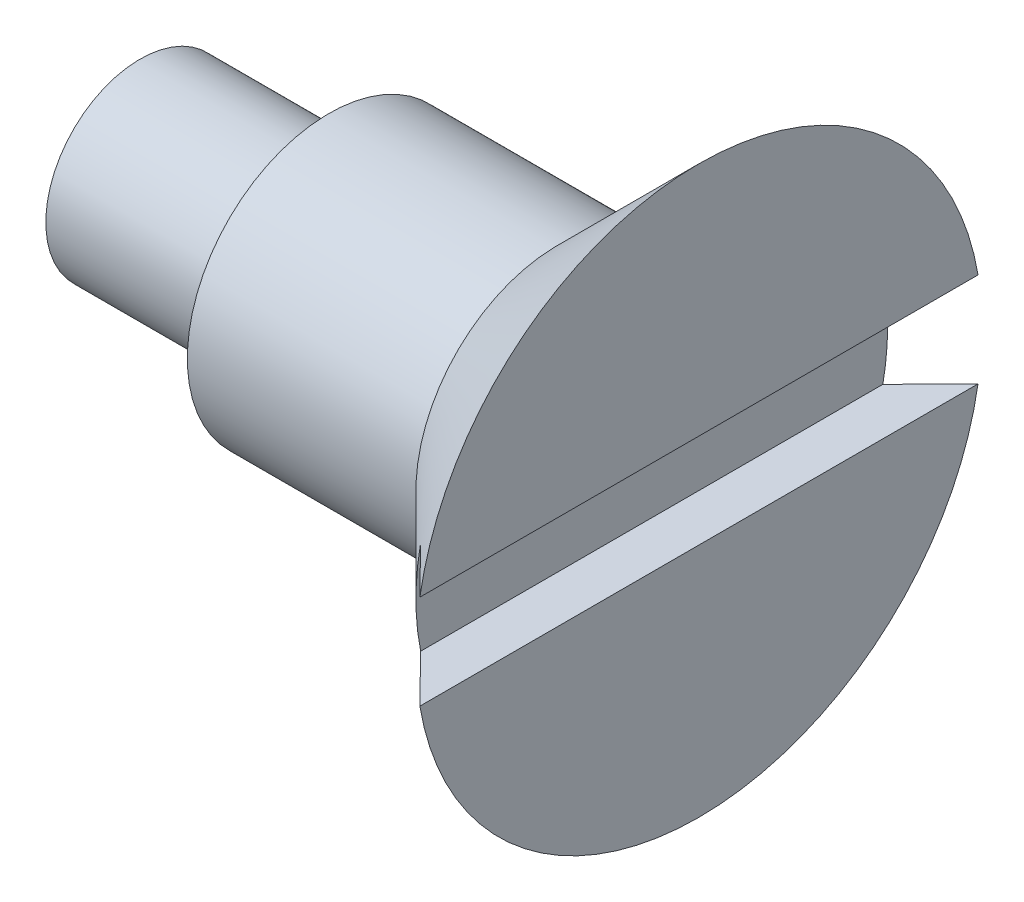
ISO-10303-21;
HEADER;
FILE_DESCRIPTION(('STEP AP214'),'2;1');
FILE_NAME('part.step','',(''),(''),'','','');
FILE_SCHEMA(('AUTOMOTIVE_DESIGN { 1 0 10303 214 1 1 1 1 }'));
ENDSEC;
DATA;
#1=APPLICATION_CONTEXT('core data for automotive mechanical design processes');
#2=APPLICATION_PROTOCOL_DEFINITION('international standard','automotive_design',2000,#1);
#3=PRODUCT_CONTEXT('',#1,'mechanical');
#4=PRODUCT('Part','Part','',(#3));
#5=PRODUCT_RELATED_PRODUCT_CATEGORY('part','',(#4));
#6=PRODUCT_DEFINITION_FORMATION('','',#4);
#7=PRODUCT_DEFINITION_CONTEXT('part definition',#1,'design');
#8=PRODUCT_DEFINITION('design','',#6,#7);
#9=PRODUCT_DEFINITION_SHAPE('','',#8);
#10=(LENGTH_UNIT() NAMED_UNIT(*) SI_UNIT(.MILLI.,.METRE.));
#11=(NAMED_UNIT(*) PLANE_ANGLE_UNIT() SI_UNIT($,.RADIAN.));
#12=(NAMED_UNIT(*) SI_UNIT($,.STERADIAN.) SOLID_ANGLE_UNIT());
#13=UNCERTAINTY_MEASURE_WITH_UNIT(LENGTH_MEASURE(1.E-05),#10,'distance_accuracy_value','');
#14=(GEOMETRIC_REPRESENTATION_CONTEXT(3) GLOBAL_UNCERTAINTY_ASSIGNED_CONTEXT((#13)) GLOBAL_UNIT_ASSIGNED_CONTEXT((#10,
#11,#12)) REPRESENTATION_CONTEXT('',''));
#15=CARTESIAN_POINT('',(0.,0.,0.));
#16=DIRECTION('',(0.,0.,1.));
#17=DIRECTION('',(1.,0.,0.));
#18=AXIS2_PLACEMENT_3D('',#15,#16,#17);
#19=CARTESIAN_POINT('',(0.,0.,5.99999999999997));
#20=DIRECTION('',(-1.,0.,0.));
#21=DIRECTION('',(0.,0.,1.));
#22=AXIS2_PLACEMENT_3D('',#19,#20,#21);
#23=PLANE('',#22);
#24=CARTESIAN_POINT('',(0.,0.,0.));
#25=DIRECTION('',(1.,0.,0.));
#26=DIRECTION('',(0.,0.,-1.));
#27=AXIS2_PLACEMENT_3D('',#24,#25,#26);
#28=CIRCLE('',#27,5.99999999999997);
#29=CARTESIAN_POINT('',(0.,-1.,5.91607978309958));
#30=VERTEX_POINT('',#29);
#31=CARTESIAN_POINT('',(0.,-1.,-5.91607978309958));
#32=VERTEX_POINT('',#31);
#33=EDGE_CURVE('E97',#30,#32,#28,.T.);
#34=ORIENTED_EDGE('',*,*,#33,.T.);
#35=DIRECTION('',(0.,0.,1.));
#36=VECTOR('',#35,1.);
#37=CARTESIAN_POINT('',(0.,-1.,5.99999999999997));
#38=LINE('',#37,#36);
#39=EDGE_CURVE('E83',#32,#30,#38,.T.);
#40=ORIENTED_EDGE('',*,*,#39,.T.);
#41=EDGE_LOOP('',(#34,#40));
#42=FACE_BOUND('',#41,.T.);
#43=ADVANCED_FACE('F37',(#42),#23,.F.);
#44=CARTESIAN_POINT('',(-13.,0.,0.));
#45=DIRECTION('',(1.,0.,0.));
#46=DIRECTION('',(0.,0.,-1.));
#47=AXIS2_PLACEMENT_3D('',#44,#45,#46);
#48=CONICAL_SURFACE('',#47,0.,1.0471975511966);
#49=CARTESIAN_POINT('',(-11.8452994616208,0.,0.));
#50=DIRECTION('',(1.,0.,0.));
#51=DIRECTION('',(0.,0.,-1.));
#52=AXIS2_PLACEMENT_3D('',#49,#50,#51);
#53=CIRCLE('',#52,2.);
#54=CARTESIAN_POINT('',(-11.8452994616208,0.,-2.));
#55=VERTEX_POINT('',#54);
#56=EDGE_CURVE('E84',#55,#55,#53,.T.);
#57=ORIENTED_EDGE('',*,*,#56,.F.);
#58=EDGE_LOOP('',(#57));
#59=FACE_BOUND('',#58,.T.);
#60=CARTESIAN_POINT('',(-13.,0.,0.));
#61=VERTEX_POINT('',#60);
#62=VERTEX_LOOP('',#61);
#63=FACE_BOUND('',#62,.T.);
#64=ADVANCED_FACE('F39',(#59,#63),#48,.T.);
#65=CARTESIAN_POINT('',(0.,0.,0.));
#66=DIRECTION('',(1.,0.,0.));
#67=DIRECTION('',(0.,0.,-1.));
#68=AXIS2_PLACEMENT_3D('',#65,#66,#67);
#69=CYLINDRICAL_SURFACE('',#68,2.);
#70=CARTESIAN_POINT('',(-7.84529946162076,0.,0.));
#71=DIRECTION('',(1.,0.,0.));
#72=DIRECTION('',(0.,0.,-1.));
#73=AXIS2_PLACEMENT_3D('',#70,#71,#72);
#74=CIRCLE('',#73,2.);
#75=CARTESIAN_POINT('',(-7.84529946162076,0.,-2.));
#76=VERTEX_POINT('',#75);
#77=EDGE_CURVE('E115',#76,#76,#74,.T.);
#78=ORIENTED_EDGE('',*,*,#77,.F.);
#79=EDGE_LOOP('',(#78));
#80=FACE_BOUND('',#79,.T.);
#81=ORIENTED_EDGE('',*,*,#56,.T.);
#82=EDGE_LOOP('',(#81));
#83=FACE_BOUND('',#82,.T.);
#84=ADVANCED_FACE('F153',(#80,#83),#69,.T.);
#85=CARTESIAN_POINT('',(-7.84529946162076,0.,3.));
#86=DIRECTION('',(1.,0.,0.));
#87=DIRECTION('',(0.,0.,-1.));
#88=AXIS2_PLACEMENT_3D('',#85,#86,#87);
#89=PLANE('',#88);
#90=CARTESIAN_POINT('',(-7.84529946162076,0.,0.));
#91=DIRECTION('',(1.,0.,0.));
#92=DIRECTION('',(0.,0.,-1.));
#93=AXIS2_PLACEMENT_3D('',#90,#91,#92);
#94=CIRCLE('',#93,3.);
#95=CARTESIAN_POINT('',(-7.84529946162076,0.,-3.));
#96=VERTEX_POINT('',#95);
#97=EDGE_CURVE('E100',#96,#96,#94,.T.);
#98=ORIENTED_EDGE('',*,*,#97,.F.);
#99=EDGE_LOOP('',(#98));
#100=FACE_BOUND('',#99,.T.);
#101=ORIENTED_EDGE('',*,*,#77,.T.);
#102=EDGE_LOOP('',(#101));
#103=FACE_BOUND('',#102,.T.);
#104=ADVANCED_FACE('F206',(#100,#103),#89,.F.);
#105=CARTESIAN_POINT('',(0.,0.,0.));
#106=DIRECTION('',(1.,0.,0.));
#107=DIRECTION('',(0.,0.,-1.));
#108=AXIS2_PLACEMENT_3D('',#105,#106,#107);
#109=CYLINDRICAL_SURFACE('',#108,3.);
#110=CARTESIAN_POINT('',(-3.,0.,0.));
#111=DIRECTION('',(1.,0.,0.));
#112=DIRECTION('',(0.,0.,-1.));
#113=AXIS2_PLACEMENT_3D('',#110,#111,#112);
#114=CIRCLE('',#113,3.);
#115=CARTESIAN_POINT('',(-3.,0.,-3.));
#116=VERTEX_POINT('',#115);
#117=EDGE_CURVE('E96',#116,#116,#114,.T.);
#118=ORIENTED_EDGE('',*,*,#117,.F.);
#119=EDGE_LOOP('',(#118));
#120=FACE_BOUND('',#119,.T.);
#121=ORIENTED_EDGE('',*,*,#97,.T.);
#122=EDGE_LOOP('',(#121));
#123=FACE_BOUND('',#122,.T.);
#124=ADVANCED_FACE('F148',(#120,#123),#109,.T.);
#125=CARTESIAN_POINT('',(-3.,0.,0.));
#126=DIRECTION('',(1.,0.,0.));
#127=DIRECTION('',(0.,0.,-1.));
#128=AXIS2_PLACEMENT_3D('',#125,#126,#127);
#129=CONICAL_SURFACE('',#128,3.,0.785398163397443);
#130=ORIENTED_EDGE('',*,*,#33,.F.);
#131=CARTESIAN_POINT('',(0.0007,-1.,5.91678971149048));
#132=CARTESIAN_POINT('',(-0.162607318509315,-1.,5.75115761852884));
#133=CARTESIAN_POINT('',(-0.325826519206074,-1.,5.58543840697202));
#134=CARTESIAN_POINT('',(-0.65215059662722,-1.,5.25361083834429));
#135=CARTESIAN_POINT('',(-0.81525525889978,-1.,5.08750227041045));
#136=CARTESIAN_POINT('',(-1.14363850904817,-1.,4.75240700108424));
#137=CARTESIAN_POINT('',(-1.30891199112516,-1.,4.58341529410106));
#138=CARTESIAN_POINT('',(-1.63885108719332,-1.,4.24511761475711));
#139=CARTESIAN_POINT('',(-1.80351709676078,-1.,4.07581202850019));
#140=CARTESIAN_POINT('',(-2.09113646904427,-1.,3.77891608066379));
#141=CARTESIAN_POINT('',(-2.21423646328889,-1.,3.65146784044968));
#142=CARTESIAN_POINT('',(-2.45993602788147,-1.,3.3960670966622));
#143=CARTESIAN_POINT('',(-2.58253555139033,-1.,3.26811454799765));
#144=CARTESIAN_POINT('',(-2.82739638158381,-1.,3.01113677517779));
#145=CARTESIAN_POINT('',(-2.94965550415176,-1.,2.88210946641282));
#146=CARTESIAN_POINT('',(-3.19308474715153,-1.,2.62311457687469));
#147=CARTESIAN_POINT('',(-3.31425522947932,-1.,2.49314733661333));
#148=CARTESIAN_POINT('',(-3.55347734543775,-1.,2.23339140104992));
#149=CARTESIAN_POINT('',(-3.67154904331894,-1.,2.10362129445326));
#150=CARTESIAN_POINT('',(-3.84678919114967,-1.,1.90713907998698));
#151=CARTESIAN_POINT('',(-3.90493003546028,-1.,1.84129534116474));
#152=CARTESIAN_POINT('',(-4.02033272590618,-1.,1.70884318625084));
#153=CARTESIAN_POINT('',(-4.07759459789594,-1.,1.64223479275218));
#154=CARTESIAN_POINT('',(-4.19059705198423,-1.,1.50838317640004));
#155=CARTESIAN_POINT('',(-4.24634442439442,-1.,1.44114570319739));
#156=CARTESIAN_POINT('',(-4.35615224777919,-1.,1.30531180859632));
#157=CARTESIAN_POINT('',(-4.41021292855056,-1.,1.23671557441733));
#158=CARTESIAN_POINT('',(-4.51573124180686,-1.,1.09776921510259));
#159=CARTESIAN_POINT('',(-4.56719412184081,-1.,1.02742309246133));
#160=CARTESIAN_POINT('',(-4.66625244668362,-1.,0.884073142096053));
#161=CARTESIAN_POINT('',(-4.71385121903676,-1.,0.811071681165573));
#162=CARTESIAN_POINT('',(-4.76841426729248,-1.,0.719019988854483));
#163=CARTESIAN_POINT('',(-4.77841389742968,-1.,0.70176695507006));
#164=CARTESIAN_POINT('',(-4.79802849740676,-1.,0.667039630778522));
#165=CARTESIAN_POINT('',(-4.80764339579793,-1.,0.649565299960209));
#166=CARTESIAN_POINT('',(-4.83583751773938,-1.,0.596790988044159));
#167=CARTESIAN_POINT('',(-4.85376700288692,-1.,0.561138294982837));
#168=CARTESIAN_POINT('',(-4.88724060678036,-1.,0.489122011077072));
#169=CARTESIAN_POINT('',(-4.90280525875267,-1.,0.45276804835838));
#170=CARTESIAN_POINT('',(-4.93114067114615,-1.,0.378971239176999));
#171=CARTESIAN_POINT('',(-4.94391179513829,-1.,0.341528535130862));
#172=CARTESIAN_POINT('',(-4.96331492806248,-1.,0.274731331464051));
#173=CARTESIAN_POINT('',(-4.9706847076367,-1.,0.245592117583684));
#174=CARTESIAN_POINT('',(-4.98310321325922,-1.,0.186824201623296));
#175=CARTESIAN_POINT('',(-4.98815258527316,-1.,0.157195638152875));
#176=CARTESIAN_POINT('',(-4.99567262062052,-1.,0.0976784753360516));
#177=CARTESIAN_POINT('',(-4.99814938437632,-1.,0.0677906613999327));
#178=CARTESIAN_POINT('',(-5.00041846078121,-1.,0.00791054321230838));
#179=CARTESIAN_POINT('',(-5.00021013857005,-1.,-0.022081784074385));
#180=CARTESIAN_POINT('',(-4.99552925768517,-1.,-0.111783048402298));
#181=CARTESIAN_POINT('',(-4.98701338219495,-1.,-0.171315029823867));
#182=CARTESIAN_POINT('',(-4.96083485299349,-1.,-0.288388298411591));
#183=CARTESIAN_POINT('',(-4.94314197860661,-1.,-0.345922334134468));
#184=CARTESIAN_POINT('',(-4.89569716333322,-1.,-0.473105905003865));
#185=CARTESIAN_POINT('',(-4.86400465704331,-1.,-0.542008375387887));
#186=CARTESIAN_POINT('',(-4.79406188189462,-1.,-0.676454737242399));
#187=CARTESIAN_POINT('',(-4.75579650178786,-1.,-0.741990427025854));
#188=CARTESIAN_POINT('',(-4.67483861075862,-1.,-0.870968335153202));
#189=CARTESIAN_POINT('',(-4.63211286143669,-1.,-0.93438938829629));
#190=CARTESIAN_POINT('',(-4.56600477030899,-1.,-1.02801925947388));
#191=CARTESIAN_POINT('',(-4.54364457678581,-1.,-1.05896289027808));
#192=CARTESIAN_POINT('',(-4.49835630127878,-1.,-1.12043124705164));
#193=CARTESIAN_POINT('',(-4.47542823551307,-1.,-1.15095598494575));
#194=CARTESIAN_POINT('',(-4.4004777659838,-1.,-1.24916076388308));
#195=CARTESIAN_POINT('',(-4.3475240183481,-1.,-1.31612926321496));
#196=CARTESIAN_POINT('',(-4.24003359841043,-1.,-1.44878719461384));
#197=CARTESIAN_POINT('',(-4.18549671889329,-1.,-1.51447645734511));
#198=CARTESIAN_POINT('',(-4.07527537432535,-1.,-1.64492622970131));
#199=CARTESIAN_POINT('',(-4.01959047448894,-1.,-1.70968637109029));
#200=CARTESIAN_POINT('',(-3.90738823153224,-1.,-1.83848251738067));
#201=CARTESIAN_POINT('',(-3.85087086495262,-1.,-1.90251850178474));
#202=CARTESIAN_POINT('',(-3.6802179026296,-1.,-2.09398481773312));
#203=CARTESIAN_POINT('',(-3.56514686943538,-1.,-2.22058045835915));
#204=CARTESIAN_POINT('',(-3.33352351173097,-1.,-2.4723465492548));
#205=CARTESIAN_POINT('',(-3.21697153933208,-1.,-2.5975173253648));
#206=CARTESIAN_POINT('',(-2.98338065364163,-1.,-2.846370506011));
#207=CARTESIAN_POINT('',(-2.86634612800305,-1.,-2.97005703316858));
#208=CARTESIAN_POINT('',(-2.63158070939988,-1.,-3.21678023725537));
#209=CARTESIAN_POINT('',(-2.5138497757386,-1.,-3.33981687539496));
#210=CARTESIAN_POINT('',(-2.16009615265814,-1.,-3.70803979106433));
#211=CARTESIAN_POINT('',(-1.92334028700561,-1.,-3.95252136145085));
#212=CARTESIAN_POINT('',(-1.54616199235268,-1.,-4.34024616466515));
#213=CARTESIAN_POINT('',(-1.40609960761181,-1.,-4.48384082068329));
#214=CARTESIAN_POINT('',(-1.1256502353192,-1.,-4.77076673689435));
#215=CARTESIAN_POINT('',(-0.985263190763728,-1.,-4.91409794140606));
#216=CARTESIAN_POINT('',(-0.70403532911954,-1.,-5.20077057030037));
#217=CARTESIAN_POINT('',(-0.563194145351994,-1.,-5.34411163473207));
#218=CARTESIAN_POINT('',(-0.281357934914174,-1.,-5.63058737243485));
#219=CARTESIAN_POINT('',(-0.140362943663766,-1.,-5.77372208054851));
#220=CARTESIAN_POINT('',(0.000699999999999637,-1.,-5.91678971149048));
#221=B_SPLINE_CURVE_WITH_KNOTS('',3,(#131,#132,#133,#134,#135,#136,#137,#138,#139,#140,#141,
#142,#143,#144,#145,#146,#147,#148,#149,#150,#151,#152,#153,#154,#155,#156,#157,#158,#159,#160,
#161,#162,#163,#164,#165,#166,#167,#168,#169,#170,#171,#172,#173,#174,#175,#176,#177,#178,#179,
#180,#181,#182,#183,#184,#185,#186,#187,#188,#189,#190,#191,#192,#193,#194,#195,#196,#197,#198,
#199,#200,#201,#202,#203,#204,#205,#206,#207,#208,#209,#210,#211,#212,#213,#214,#215,#216,#217,
#218,#219,#220),.UNSPECIFIED.,.F.,.F.,(4,2,2,2,2,2,2,2,2,2,2,2,2,2,2,2,2,2,2,2,2,2,2,2,2,2,2,2,
2,2,2,2,2,2,2,2,2,2,2,2,2,2,2,2,4),(0.,0.697803517038659,1.39619900961924,2.10532581424133,
2.81385354230447,3.34542560714681,3.87704633085894,4.41029440011359,4.94335810483505,
5.46967005392525,5.73318276579127,5.99668771167144,6.25869692042871,6.52067027547976,
6.7820913299544,7.04328482162607,7.10310466318572,7.16293556283866,7.28259249608506,
7.40114244661833,7.51967695896752,7.60976612612796,7.69983019863976,7.78968021136254,
7.87955146856271,8.05899978683347,8.23904283195005,8.46597578037929,8.69343761415733,
8.92273527289017,9.03726247596328,9.1517864119628,9.4078708319171,9.66398892309654,
9.92020586273888,10.1764300365691,10.6896409306576,11.2027320047635,11.7135693246928,
12.2244367977944,13.2454191574668,13.8471932047474,14.4490824444518,15.0519472067194,
15.6546942226632),.UNSPECIFIED.);
#222=CARTESIAN_POINT('',(-1.,-1.,4.89897948556633));
#223=VERTEX_POINT('',#222);
#224=EDGE_CURVE('E103',#30,#223,#221,.T.);
#225=ORIENTED_EDGE('',*,*,#224,.T.);
#226=CARTESIAN_POINT('',(-1.,0.,0.));
#227=DIRECTION('',(1.,0.,0.));
#228=DIRECTION('',(0.,0.,-1.));
#229=AXIS2_PLACEMENT_3D('',#226,#227,#228);
#230=CIRCLE('',#229,4.99999999999998);
#231=CARTESIAN_POINT('',(-1.,1.,4.89897948556633));
#232=VERTEX_POINT('',#231);
#233=EDGE_CURVE('E11',#232,#223,#230,.T.);
#234=ORIENTED_EDGE('',*,*,#233,.F.);
#235=CARTESIAN_POINT('',(0.0007,1.,-5.91678971149048));
#236=CARTESIAN_POINT('',(-0.162607318509315,1.,-5.75115761852884));
#237=CARTESIAN_POINT('',(-0.325826519206074,1.,-5.58543840697202));
#238=CARTESIAN_POINT('',(-0.65215059662722,1.,-5.25361083834429));
#239=CARTESIAN_POINT('',(-0.81525525889978,1.,-5.08750227041045));
#240=CARTESIAN_POINT('',(-1.14363850904817,1.,-4.75240700108424));
#241=CARTESIAN_POINT('',(-1.30891199112516,1.,-4.58341529410106));
#242=CARTESIAN_POINT('',(-1.63885108719332,1.,-4.24511761475711));
#243=CARTESIAN_POINT('',(-1.80351709676078,1.,-4.07581202850019));
#244=CARTESIAN_POINT('',(-2.09113646904427,1.,-3.77891608066379));
#245=CARTESIAN_POINT('',(-2.21423646328889,1.,-3.65146784044968));
#246=CARTESIAN_POINT('',(-2.45993602788147,1.,-3.3960670966622));
#247=CARTESIAN_POINT('',(-2.58253555139033,1.,-3.26811454799765));
#248=CARTESIAN_POINT('',(-2.82739638158381,1.,-3.01113677517779));
#249=CARTESIAN_POINT('',(-2.94965550415176,1.,-2.88210946641282));
#250=CARTESIAN_POINT('',(-3.19308474715153,1.,-2.62311457687469));
#251=CARTESIAN_POINT('',(-3.31425522947932,1.,-2.49314733661333));
#252=CARTESIAN_POINT('',(-3.55347734543775,1.,-2.23339140104992));
#253=CARTESIAN_POINT('',(-3.67154904331894,1.,-2.10362129445326));
#254=CARTESIAN_POINT('',(-3.84678919114967,1.,-1.90713907998698));
#255=CARTESIAN_POINT('',(-3.90493003546028,1.,-1.84129534116474));
#256=CARTESIAN_POINT('',(-4.02033272590618,1.,-1.70884318625084));
#257=CARTESIAN_POINT('',(-4.07759459789594,1.,-1.64223479275218));
#258=CARTESIAN_POINT('',(-4.19059705198423,1.,-1.50838317640004));
#259=CARTESIAN_POINT('',(-4.24634442439442,1.,-1.44114570319739));
#260=CARTESIAN_POINT('',(-4.35615224777919,1.,-1.30531180859632));
#261=CARTESIAN_POINT('',(-4.41021292855056,1.,-1.23671557441733));
#262=CARTESIAN_POINT('',(-4.51573124180686,1.,-1.09776921510259));
#263=CARTESIAN_POINT('',(-4.56719412184081,1.,-1.02742309246133));
#264=CARTESIAN_POINT('',(-4.66625244668362,1.,-0.884073142096053));
#265=CARTESIAN_POINT('',(-4.71385121903676,1.,-0.811071681165573));
#266=CARTESIAN_POINT('',(-4.76841426729248,1.,-0.719019988854483));
#267=CARTESIAN_POINT('',(-4.77841389742968,1.,-0.70176695507006));
#268=CARTESIAN_POINT('',(-4.79802849740676,1.,-0.667039630778522));
#269=CARTESIAN_POINT('',(-4.80764339579793,1.,-0.649565299960209));
#270=CARTESIAN_POINT('',(-4.83583751773938,1.,-0.596790988044159));
#271=CARTESIAN_POINT('',(-4.85376700288692,1.,-0.561138294982837));
#272=CARTESIAN_POINT('',(-4.88724060678036,1.,-0.489122011077072));
#273=CARTESIAN_POINT('',(-4.90280525875267,1.,-0.45276804835838));
#274=CARTESIAN_POINT('',(-4.93114067114615,1.,-0.378971239176999));
#275=CARTESIAN_POINT('',(-4.94391179513829,1.,-0.341528535130862));
#276=CARTESIAN_POINT('',(-4.96331492806248,1.,-0.274731331464051));
#277=CARTESIAN_POINT('',(-4.9706847076367,1.,-0.245592117583684));
#278=CARTESIAN_POINT('',(-4.98310321325922,1.,-0.186824201623296));
#279=CARTESIAN_POINT('',(-4.98815258527316,1.,-0.157195638152875));
#280=CARTESIAN_POINT('',(-4.99567262062052,1.,-0.0976784753360516));
#281=CARTESIAN_POINT('',(-4.99814938437632,1.,-0.0677906613999327));
#282=CARTESIAN_POINT('',(-5.00041846078121,1.,-0.00791054321230838));
#283=CARTESIAN_POINT('',(-5.00021013857005,1.,0.022081784074385));
#284=CARTESIAN_POINT('',(-4.99552925768517,1.,0.111783048402298));
#285=CARTESIAN_POINT('',(-4.98701338219495,1.,0.171315029823867));
#286=CARTESIAN_POINT('',(-4.96083485299349,1.,0.288388298411591));
#287=CARTESIAN_POINT('',(-4.94314197860661,1.,0.345922334134468));
#288=CARTESIAN_POINT('',(-4.89569716333322,1.,0.473105905003865));
#289=CARTESIAN_POINT('',(-4.86400465704331,1.,0.542008375387887));
#290=CARTESIAN_POINT('',(-4.79406188189462,1.,0.676454737242399));
#291=CARTESIAN_POINT('',(-4.75579650178786,1.,0.741990427025854));
#292=CARTESIAN_POINT('',(-4.67483861075862,1.,0.870968335153202));
#293=CARTESIAN_POINT('',(-4.63211286143669,1.,0.93438938829629));
#294=CARTESIAN_POINT('',(-4.56600477030899,1.,1.02801925947388));
#295=CARTESIAN_POINT('',(-4.54364457678581,1.,1.05896289027808));
#296=CARTESIAN_POINT('',(-4.49835630127878,1.,1.12043124705164));
#297=CARTESIAN_POINT('',(-4.47542823551307,1.,1.15095598494575));
#298=CARTESIAN_POINT('',(-4.4004777659838,1.,1.24916076388308));
#299=CARTESIAN_POINT('',(-4.3475240183481,1.,1.31612926321496));
#300=CARTESIAN_POINT('',(-4.24003359841043,1.,1.44878719461384));
#301=CARTESIAN_POINT('',(-4.18549671889329,1.,1.51447645734511));
#302=CARTESIAN_POINT('',(-4.07527537432535,1.,1.64492622970131));
#303=CARTESIAN_POINT('',(-4.01959047448894,1.,1.70968637109029));
#304=CARTESIAN_POINT('',(-3.90738823153224,1.,1.83848251738067));
#305=CARTESIAN_POINT('',(-3.85087086495262,1.,1.90251850178474));
#306=CARTESIAN_POINT('',(-3.6802179026296,1.,2.09398481773312));
#307=CARTESIAN_POINT('',(-3.56514686943538,1.,2.22058045835915));
#308=CARTESIAN_POINT('',(-3.33352351173097,1.,2.4723465492548));
#309=CARTESIAN_POINT('',(-3.21697153933208,1.,2.5975173253648));
#310=CARTESIAN_POINT('',(-2.98338065364163,1.,2.846370506011));
#311=CARTESIAN_POINT('',(-2.86634612800305,1.,2.97005703316858));
#312=CARTESIAN_POINT('',(-2.63158070939988,1.,3.21678023725537));
#313=CARTESIAN_POINT('',(-2.5138497757386,1.,3.33981687539496));
#314=CARTESIAN_POINT('',(-2.16009615265814,1.,3.70803979106433));
#315=CARTESIAN_POINT('',(-1.92334028700561,1.,3.95252136145085));
#316=CARTESIAN_POINT('',(-1.54616199235268,1.,4.34024616466515));
#317=CARTESIAN_POINT('',(-1.40609960761181,1.,4.48384082068329));
#318=CARTESIAN_POINT('',(-1.1256502353192,1.,4.77076673689435));
#319=CARTESIAN_POINT('',(-0.985263190763728,1.,4.91409794140606));
#320=CARTESIAN_POINT('',(-0.70403532911954,1.,5.20077057030037));
#321=CARTESIAN_POINT('',(-0.563194145351994,1.,5.34411163473207));
#322=CARTESIAN_POINT('',(-0.281357934914174,1.,5.63058737243485));
#323=CARTESIAN_POINT('',(-0.140362943663766,1.,5.77372208054851));
#324=CARTESIAN_POINT('',(0.000699999999999637,1.,5.91678971149048));
#325=B_SPLINE_CURVE_WITH_KNOTS('',3,(#235,#236,#237,#238,#239,#240,#241,#242,#243,#244,#245,
#246,#247,#248,#249,#250,#251,#252,#253,#254,#255,#256,#257,#258,#259,#260,#261,#262,#263,#264,
#265,#266,#267,#268,#269,#270,#271,#272,#273,#274,#275,#276,#277,#278,#279,#280,#281,#282,#283,
#284,#285,#286,#287,#288,#289,#290,#291,#292,#293,#294,#295,#296,#297,#298,#299,#300,#301,#302,
#303,#304,#305,#306,#307,#308,#309,#310,#311,#312,#313,#314,#315,#316,#317,#318,#319,#320,#321,
#322,#323,#324),.UNSPECIFIED.,.F.,.F.,(4,2,2,2,2,2,2,2,2,2,2,2,2,2,2,2,2,2,2,2,2,2,2,2,2,2,2,2,
2,2,2,2,2,2,2,2,2,2,2,2,2,2,2,2,4),(0.,0.697803517038659,1.39619900961924,2.10532581424133,
2.81385354230447,3.34542560714681,3.87704633085894,4.41029440011359,4.94335810483505,
5.46967005392525,5.73318276579127,5.99668771167144,6.25869692042871,6.52067027547976,
6.7820913299544,7.04328482162607,7.10310466318572,7.16293556283866,7.28259249608506,
7.40114244661833,7.51967695896752,7.60976612612796,7.69983019863976,7.78968021136254,
7.87955146856271,8.05899978683347,8.23904283195005,8.46597578037929,8.69343761415733,
8.92273527289017,9.03726247596328,9.1517864119628,9.4078708319171,9.66398892309654,
9.92020586273888,10.1764300365691,10.6896409306576,11.2027320047635,11.7135693246928,
12.2244367977944,13.2454191574668,13.8471932047474,14.4490824444518,15.0519472067194,
15.6546942226632),.UNSPECIFIED.);
#326=CARTESIAN_POINT('',(0.,1.,5.91607978309958));
#327=VERTEX_POINT('',#326);
#328=EDGE_CURVE('E78',#232,#327,#325,.T.);
#329=ORIENTED_EDGE('',*,*,#328,.T.);
#330=CARTESIAN_POINT('',(0.,1.,-5.91607978309958));
#331=VERTEX_POINT('',#330);
#332=EDGE_CURVE('E91',#331,#327,#28,.T.);
#333=ORIENTED_EDGE('',*,*,#332,.F.);
#334=CARTESIAN_POINT('',(-1.,1.,-4.89897948556633));
#335=VERTEX_POINT('',#334);
#336=EDGE_CURVE('E52',#331,#335,#325,.T.);
#337=ORIENTED_EDGE('',*,*,#336,.T.);
#338=CARTESIAN_POINT('',(-1.,-1.,-4.89897948556633));
#339=VERTEX_POINT('',#338);
#340=EDGE_CURVE('E41',#339,#335,#230,.T.);
#341=ORIENTED_EDGE('',*,*,#340,.F.);
#342=EDGE_CURVE('E105',#339,#32,#221,.T.);
#343=ORIENTED_EDGE('',*,*,#342,.T.);
#344=EDGE_LOOP('',(#130,#225,#234,#329,#333,#337,#341,#343));
#345=FACE_BOUND('',#344,.T.);
#346=ORIENTED_EDGE('',*,*,#117,.T.);
#347=EDGE_LOOP('',(#346));
#348=FACE_BOUND('',#347,.T.);
#349=ADVANCED_FACE('F89',(#345,#348),#129,.T.);
#350=ORIENTED_EDGE('',*,*,#332,.T.);
#351=DIRECTION('',(0.,0.,-1.));
#352=VECTOR('',#351,1.);
#353=CARTESIAN_POINT('',(0.,1.,5.99999999999997));
#354=LINE('',#353,#352);
#355=EDGE_CURVE('E75',#327,#331,#354,.T.);
#356=ORIENTED_EDGE('',*,*,#355,.T.);
#357=EDGE_LOOP('',(#350,#356));
#358=FACE_BOUND('',#357,.T.);
#359=ADVANCED_FACE('F95',(#358),#23,.F.);
#360=CARTESIAN_POINT('',(-1.,0.,0.));
#361=DIRECTION('',(1.,0.,0.));
#362=DIRECTION('',(0.,0.,-1.));
#363=AXIS2_PLACEMENT_3D('',#360,#361,#362);
#364=PLANE('',#363);
#365=ORIENTED_EDGE('',*,*,#233,.T.);
#366=DIRECTION('',(0.,0.,-1.));
#367=VECTOR('',#366,1.);
#368=CARTESIAN_POINT('',(-1.,-1.,8.1189559473886));
#369=LINE('',#368,#367);
#370=EDGE_CURVE('E93',#223,#339,#369,.T.);
#371=ORIENTED_EDGE('',*,*,#370,.T.);
#372=ORIENTED_EDGE('',*,*,#340,.T.);
#373=DIRECTION('',(0.,0.,1.));
#374=VECTOR('',#373,1.);
#375=CARTESIAN_POINT('',(-1.,1.,8.1189559473886));
#376=LINE('',#375,#374);
#377=EDGE_CURVE('E125',#335,#232,#376,.T.);
#378=ORIENTED_EDGE('',*,*,#377,.T.);
#379=EDGE_LOOP('',(#365,#371,#372,#378));
#380=FACE_BOUND('',#379,.T.);
#381=ADVANCED_FACE('F124',(#380),#364,.T.);
#382=CARTESIAN_POINT('',(-1.,-1.,8.1189559473886));
#383=DIRECTION('',(0.,-1.,0.));
#384=DIRECTION('',(0.,0.,-1.));
#385=AXIS2_PLACEMENT_3D('',#382,#383,#384);
#386=PLANE('',#385);
#387=ORIENTED_EDGE('',*,*,#39,.F.);
#388=ORIENTED_EDGE('',*,*,#342,.F.);
#389=ORIENTED_EDGE('',*,*,#370,.F.);
#390=ORIENTED_EDGE('',*,*,#224,.F.);
#391=EDGE_LOOP('',(#387,#388,#389,#390));
#392=FACE_BOUND('',#391,.T.);
#393=ADVANCED_FACE('F140',(#392),#386,.F.);
#394=CARTESIAN_POINT('',(-1.,1.,8.1189559473886));
#395=DIRECTION('',(0.,1.,0.));
#396=DIRECTION('',(0.,0.,1.));
#397=AXIS2_PLACEMENT_3D('',#394,#395,#396);
#398=PLANE('',#397);
#399=ORIENTED_EDGE('',*,*,#355,.F.);
#400=ORIENTED_EDGE('',*,*,#328,.F.);
#401=ORIENTED_EDGE('',*,*,#377,.F.);
#402=ORIENTED_EDGE('',*,*,#336,.F.);
#403=EDGE_LOOP('',(#399,#400,#401,#402));
#404=FACE_BOUND('',#403,.T.);
#405=ADVANCED_FACE('F77',(#404),#398,.F.);
#406=CLOSED_SHELL('',(#43,#64,#84,#104,#124,#349,#359,#381,#393,#405));
#407=MANIFOLD_SOLID_BREP('B2',#406);
#408=ADVANCED_BREP_SHAPE_REPRESENTATION('',(#18,#407),#14);
#409=SHAPE_DEFINITION_REPRESENTATION(#9,#408);
ENDSEC;
END-ISO-10303-21;
